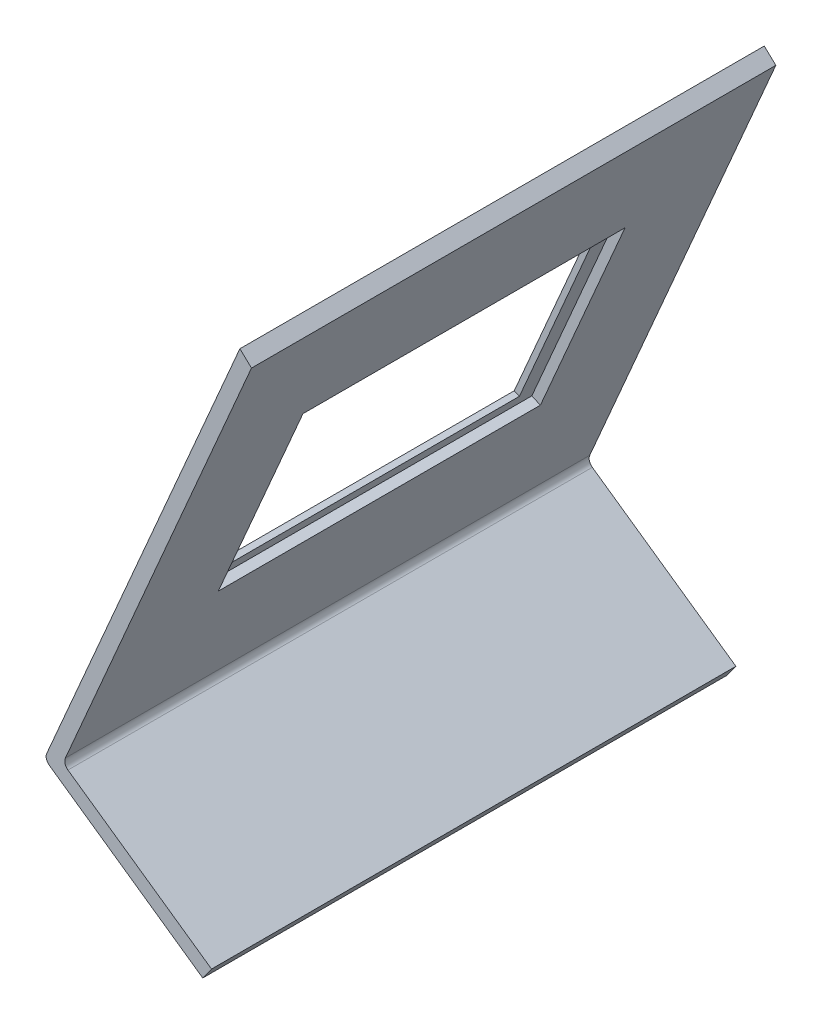
ISO-10303-21;
HEADER;
FILE_DESCRIPTION(('STEP AP214'),'2;1');
FILE_NAME('part.step','',(''),(''),'','','');
FILE_SCHEMA(('AUTOMOTIVE_DESIGN { 1 0 10303 214 1 1 1 1 }'));
ENDSEC;
DATA;
#1=APPLICATION_CONTEXT('core data for automotive mechanical design processes');
#2=APPLICATION_PROTOCOL_DEFINITION('international standard','automotive_design',2000,#1);
#3=PRODUCT_CONTEXT('',#1,'mechanical');
#4=PRODUCT('Part','Part','',(#3));
#5=PRODUCT_RELATED_PRODUCT_CATEGORY('part','',(#4));
#6=PRODUCT_DEFINITION_FORMATION('','',#4);
#7=PRODUCT_DEFINITION_CONTEXT('part definition',#1,'design');
#8=PRODUCT_DEFINITION('design','',#6,#7);
#9=PRODUCT_DEFINITION_SHAPE('','',#8);
#10=(LENGTH_UNIT() NAMED_UNIT(*) SI_UNIT(.MILLI.,.METRE.));
#11=(NAMED_UNIT(*) PLANE_ANGLE_UNIT() SI_UNIT($,.RADIAN.));
#12=(NAMED_UNIT(*) SI_UNIT($,.STERADIAN.) SOLID_ANGLE_UNIT());
#13=UNCERTAINTY_MEASURE_WITH_UNIT(LENGTH_MEASURE(1.E-05),#10,'distance_accuracy_value','');
#14=(GEOMETRIC_REPRESENTATION_CONTEXT(3) GLOBAL_UNCERTAINTY_ASSIGNED_CONTEXT((#13)) GLOBAL_UNIT_ASSIGNED_CONTEXT((#10,
#11,#12)) REPRESENTATION_CONTEXT('',''));
#15=CARTESIAN_POINT('',(0.,0.,0.));
#16=DIRECTION('',(0.,0.,1.));
#17=DIRECTION('',(1.,0.,0.));
#18=AXIS2_PLACEMENT_3D('',#15,#16,#17);
#19=CARTESIAN_POINT('',(13.5818415381511,148.863586311308,-140.));
#20=DIRECTION('',(0.917997186135404,-0.396586896212521,0.));
#21=DIRECTION('',(0.396586896212521,0.917997186135404,0.));
#22=AXIS2_PLACEMENT_3D('',#19,#20,#21);
#23=PLANE('',#22);
#24=DIRECTION('',(0.396586896212521,0.917997186135404,0.));
#25=VECTOR('',#24,1.);
#26=CARTESIAN_POINT('',(-0.247086932173506,116.853155446686,-113.));
#27=LINE('',#26,#25);
#28=CARTESIAN_POINT('',(-22.8525400162872,64.5273158369683,-113.));
#29=VERTEX_POINT('',#28);
#30=CARTESIAN_POINT('',(-0.247086932173493,116.853155446686,-113.));
#31=VERTEX_POINT('',#30);
#32=EDGE_CURVE('E61',#29,#31,#27,.T.);
#33=ORIENTED_EDGE('',*,*,#32,.F.);
#34=DIRECTION('',(0.,0.,-1.));
#35=VECTOR('',#34,1.);
#36=CARTESIAN_POINT('',(-22.8525400162872,64.5273158369683,-113.));
#37=LINE('',#36,#35);
#38=CARTESIAN_POINT('',(-22.8525400162872,64.5273158369682,-27.));
#39=VERTEX_POINT('',#38);
#40=EDGE_CURVE('E280',#39,#29,#37,.T.);
#41=ORIENTED_EDGE('',*,*,#40,.F.);
#42=DIRECTION('',(-0.396586896212521,-0.917997186135404,0.));
#43=VECTOR('',#42,1.);
#44=CARTESIAN_POINT('',(-22.8525400162872,64.5273158369682,-27.));
#45=LINE('',#44,#43);
#46=CARTESIAN_POINT('',(-0.247086932173506,116.853155446686,-27.));
#47=VERTEX_POINT('',#46);
#48=EDGE_CURVE('E287',#47,#39,#45,.T.);
#49=ORIENTED_EDGE('',*,*,#48,.F.);
#50=DIRECTION('',(0.,0.,1.));
#51=VECTOR('',#50,1.);
#52=CARTESIAN_POINT('',(-0.247086932173506,116.853155446686,-27.));
#53=LINE('',#52,#51);
#54=EDGE_CURVE('E286',#31,#47,#53,.T.);
#55=ORIENTED_EDGE('',*,*,#54,.F.);
#56=EDGE_LOOP('',(#33,#41,#49,#55));
#57=FACE_BOUND('',#56,.T.);
#58=DIRECTION('',(0.396586896212521,0.917997186135404,0.));
#59=VECTOR('',#58,1.);
#60=CARTESIAN_POINT('',(13.5818415381511,148.863586311308,-140.));
#61=LINE('',#60,#59);
#62=CARTESIAN_POINT('',(-36.6814684866118,32.5168849723467,-140.));
#63=VERTEX_POINT('',#62);
#64=CARTESIAN_POINT('',(13.0044582360656,147.527091707734,-140.));
#65=VERTEX_POINT('',#64);
#66=EDGE_CURVE('E177',#63,#65,#61,.T.);
#67=ORIENTED_EDGE('',*,*,#66,.T.);
#68=DIRECTION('',(0.,0.,1.));
#69=VECTOR('',#68,1.);
#70=CARTESIAN_POINT('',(13.0044582360656,147.527091707734,-140.));
#71=LINE('',#70,#69);
#72=CARTESIAN_POINT('',(13.0044582360656,147.527091707734,0.));
#73=VERTEX_POINT('',#72);
#74=EDGE_CURVE('E160',#65,#73,#71,.T.);
#75=ORIENTED_EDGE('',*,*,#74,.T.);
#76=DIRECTION('',(0.396586896212521,0.917997186135404,0.));
#77=VECTOR('',#76,1.);
#78=CARTESIAN_POINT('',(13.5818415381511,148.863586311308,0.));
#79=LINE('',#78,#77);
#80=CARTESIAN_POINT('',(-36.6814684866118,32.5168849723467,0.));
#81=VERTEX_POINT('',#80);
#82=EDGE_CURVE('E198',#81,#73,#79,.T.);
#83=ORIENTED_EDGE('',*,*,#82,.F.);
#84=DIRECTION('',(0.,0.,1.));
#85=VECTOR('',#84,1.);
#86=CARTESIAN_POINT('',(-36.6814684866118,32.5168849723467,-140.));
#87=LINE('',#86,#85);
#88=EDGE_CURVE('E173',#63,#81,#87,.T.);
#89=ORIENTED_EDGE('',*,*,#88,.F.);
#90=EDGE_LOOP('',(#67,#75,#83,#89));
#91=FACE_BOUND('',#90,.T.);
#92=ADVANCED_FACE('F39',(#57,#91),#23,.T.);
#93=CARTESIAN_POINT('',(-40.9576022144495,28.6788218175524,-140.));
#94=DIRECTION('',(-0.573576436351047,-0.819152044288991,0.));
#95=DIRECTION('',(0.819152044288991,-0.573576436351047,0.));
#96=AXIS2_PLACEMENT_3D('',#93,#94,#95);
#97=PLANE('',#96);
#98=DIRECTION('',(0.819152044288991,-0.573576436351047,0.));
#99=VECTOR('',#98,1.);
#100=CARTESIAN_POINT('',(-40.9576022144495,28.6788218175524,0.));
#101=LINE('',#100,#99);
#102=CARTESIAN_POINT('',(-40.9576022144495,28.6788218175524,0.));
#103=VERTEX_POINT('',#102);
#104=CARTESIAN_POINT('',(0.,0.,0.));
#105=VERTEX_POINT('',#104);
#106=EDGE_CURVE('E187',#103,#105,#101,.T.);
#107=ORIENTED_EDGE('',*,*,#106,.F.);
#108=DIRECTION('',(0.,0.,1.));
#109=VECTOR('',#108,1.);
#110=CARTESIAN_POINT('',(-40.9576022144495,28.6788218175524,-140.));
#111=LINE('',#110,#109);
#112=CARTESIAN_POINT('',(-40.9576022144495,28.6788218175524,-140.));
#113=VERTEX_POINT('',#112);
#114=EDGE_CURVE('E11',#113,#103,#111,.T.);
#115=ORIENTED_EDGE('',*,*,#114,.F.);
#116=DIRECTION('',(0.819152044288991,-0.573576436351047,0.));
#117=VECTOR('',#116,1.);
#118=CARTESIAN_POINT('',(-40.9576022144495,28.6788218175524,-140.));
#119=LINE('',#118,#117);
#120=CARTESIAN_POINT('',(0.,0.,-140.));
#121=VERTEX_POINT('',#120);
#122=EDGE_CURVE('E202',#113,#121,#119,.T.);
#123=ORIENTED_EDGE('',*,*,#122,.T.);
#124=DIRECTION('',(0.,0.,1.));
#125=VECTOR('',#124,1.);
#126=CARTESIAN_POINT('',(0.,0.,-140.));
#127=LINE('',#126,#125);
#128=EDGE_CURVE('E43',#121,#105,#127,.T.);
#129=ORIENTED_EDGE('',*,*,#128,.T.);
#130=EDGE_LOOP('',(#107,#115,#123,#129));
#131=FACE_BOUND('',#130,.T.);
#132=ADVANCED_FACE('F41',(#131),#97,.T.);
#133=CARTESIAN_POINT('',(-39.8104493417475,30.3171259061304,-140.));
#134=DIRECTION('',(0.,0.,1.));
#135=DIRECTION('',(1.,0.,0.));
#136=AXIS2_PLACEMENT_3D('',#133,#134,#135);
#137=CYLINDRICAL_SURFACE('',#136,2.);
#138=CARTESIAN_POINT('',(-39.8104493417475,30.3171259061304,0.));
#139=DIRECTION('',(0.,0.,1.));
#140=DIRECTION('',(-1.,0.,0.));
#141=AXIS2_PLACEMENT_3D('',#138,#139,#140);
#142=CIRCLE('',#141,2.);
#143=CARTESIAN_POINT('',(-41.6464437140183,31.1102996985554,0.));
#144=VERTEX_POINT('',#143);
#145=EDGE_CURVE('E205',#144,#103,#142,.T.);
#146=ORIENTED_EDGE('',*,*,#145,.F.);
#147=DIRECTION('',(0.,0.,1.));
#148=VECTOR('',#147,1.);
#149=CARTESIAN_POINT('',(-41.6464437140183,31.1102996985554,-140.));
#150=LINE('',#149,#148);
#151=CARTESIAN_POINT('',(-41.6464437140183,31.1102996985554,-140.));
#152=VERTEX_POINT('',#151);
#153=EDGE_CURVE('E48',#152,#144,#150,.T.);
#154=ORIENTED_EDGE('',*,*,#153,.F.);
#155=CARTESIAN_POINT('',(-39.8104493417475,30.3171259061304,-140.));
#156=DIRECTION('',(0.,0.,1.));
#157=DIRECTION('',(-1.,0.,0.));
#158=AXIS2_PLACEMENT_3D('',#155,#156,#157);
#159=CIRCLE('',#158,2.);
#160=EDGE_CURVE('E178',#152,#113,#159,.T.);
#161=ORIENTED_EDGE('',*,*,#160,.T.);
#162=ORIENTED_EDGE('',*,*,#114,.T.);
#163=EDGE_LOOP('',(#146,#154,#161,#162));
#164=FACE_BOUND('',#163,.T.);
#165=ADVANCED_FACE('F223',(#164),#137,.T.);
#166=CARTESIAN_POINT('',(-41.6464437140183,31.1102996985554,-140.));
#167=DIRECTION('',(-0.917997186135404,0.396586896212521,0.));
#168=DIRECTION('',(-0.396586896212521,-0.917997186135404,0.));
#169=AXIS2_PLACEMENT_3D('',#166,#167,#168);
#170=PLANE('',#169);
#171=DIRECTION('',(0.,0.,-1.));
#172=VECTOR('',#171,1.);
#173=CARTESIAN_POINT('',(-5.10883636535266,115.68551147313,-140.));
#174=LINE('',#173,#172);
#175=CARTESIAN_POINT('',(-5.10883636535266,115.68551147313,-31.5));
#176=VERTEX_POINT('',#175);
#177=CARTESIAN_POINT('',(-5.10883636535266,115.68551147313,-108.5));
#178=VERTEX_POINT('',#177);
#179=EDGE_CURVE('E262',#176,#178,#174,.T.);
#180=ORIENTED_EDGE('',*,*,#179,.F.);
#181=DIRECTION('',(0.396586896212521,0.917997186135404,0.));
#182=VECTOR('',#181,1.);
#183=CARTESIAN_POINT('',(-41.6464437140183,31.1102996985554,-31.5));
#184=LINE('',#183,#182);
#185=CARTESIAN_POINT('',(-25.3347680721912,68.8676549802246,-31.5));
#186=VERTEX_POINT('',#185);
#187=EDGE_CURVE('E255',#186,#176,#184,.T.);
#188=ORIENTED_EDGE('',*,*,#187,.F.);
#189=DIRECTION('',(0.,0.,1.));
#190=VECTOR('',#189,1.);
#191=CARTESIAN_POINT('',(-25.3347680721912,68.8676549802246,-140.));
#192=LINE('',#191,#190);
#193=CARTESIAN_POINT('',(-25.3347680721912,68.8676549802246,-108.5));
#194=VERTEX_POINT('',#193);
#195=EDGE_CURVE('E259',#194,#186,#192,.T.);
#196=ORIENTED_EDGE('',*,*,#195,.F.);
#197=DIRECTION('',(-0.396586896212521,-0.917997186135404,0.));
#198=VECTOR('',#197,1.);
#199=CARTESIAN_POINT('',(-41.6464437140183,31.1102996985554,-108.5));
#200=LINE('',#199,#198);
#201=EDGE_CURVE('E258',#178,#194,#200,.T.);
#202=ORIENTED_EDGE('',*,*,#201,.F.);
#203=EDGE_LOOP('',(#180,#188,#196,#202));
#204=FACE_BOUND('',#203,.T.);
#205=DIRECTION('',(-0.396586896212521,-0.917997186135404,0.));
#206=VECTOR('',#205,1.);
#207=CARTESIAN_POINT('',(-41.6464437140183,31.1102996985554,0.));
#208=LINE('',#207,#206);
#209=CARTESIAN_POINT('',(9.90985279360946,150.449933896158,0.));
#210=VERTEX_POINT('',#209);
#211=EDGE_CURVE('E175',#210,#144,#208,.T.);
#212=ORIENTED_EDGE('',*,*,#211,.F.);
#213=DIRECTION('',(0.,0.,1.));
#214=VECTOR('',#213,1.);
#215=CARTESIAN_POINT('',(9.90985279360946,150.449933896158,-140.));
#216=LINE('',#215,#214);
#217=CARTESIAN_POINT('',(9.90985279360946,150.449933896158,-140.));
#218=VERTEX_POINT('',#217);
#219=EDGE_CURVE('E155',#218,#210,#216,.T.);
#220=ORIENTED_EDGE('',*,*,#219,.F.);
#221=DIRECTION('',(-0.396586896212521,-0.917997186135404,0.));
#222=VECTOR('',#221,1.);
#223=CARTESIAN_POINT('',(-41.6464437140183,31.1102996985554,-140.));
#224=LINE('',#223,#222);
#225=EDGE_CURVE('E169',#218,#152,#224,.T.);
#226=ORIENTED_EDGE('',*,*,#225,.T.);
#227=ORIENTED_EDGE('',*,*,#153,.T.);
#228=EDGE_LOOP('',(#212,#220,#226,#227));
#229=FACE_BOUND('',#228,.T.);
#230=ADVANCED_FACE('F166',(#204,#229),#170,.T.);
#231=CARTESIAN_POINT('',(-34.8454741143409,31.7237111799217,-140.));
#232=DIRECTION('',(0.,0.,1.));
#233=DIRECTION('',(1.,0.,0.));
#234=AXIS2_PLACEMENT_3D('',#231,#232,#233);
#235=CYLINDRICAL_SURFACE('',#234,2.00000000000001);
#236=CARTESIAN_POINT('',(-34.8454741143409,31.7237111799217,0.));
#237=DIRECTION('',(0.,0.,-1.));
#238=DIRECTION('',(1.,0.,0.));
#239=AXIS2_PLACEMENT_3D('',#236,#237,#238);
#240=CIRCLE('',#239,2.00000000000001);
#241=CARTESIAN_POINT('',(-35.992626987043,30.0854070913437,0.));
#242=VERTEX_POINT('',#241);
#243=EDGE_CURVE('E196',#242,#81,#240,.T.);
#244=ORIENTED_EDGE('',*,*,#243,.F.);
#245=DIRECTION('',(0.,0.,1.));
#246=VECTOR('',#245,1.);
#247=CARTESIAN_POINT('',(-35.992626987043,30.0854070913437,-140.));
#248=LINE('',#247,#246);
#249=CARTESIAN_POINT('',(-35.992626987043,30.0854070913437,-140.));
#250=VERTEX_POINT('',#249);
#251=EDGE_CURVE('E209',#250,#242,#248,.T.);
#252=ORIENTED_EDGE('',*,*,#251,.F.);
#253=CARTESIAN_POINT('',(-34.8454741143409,31.7237111799217,-140.));
#254=DIRECTION('',(0.,0.,-1.));
#255=DIRECTION('',(1.,0.,0.));
#256=AXIS2_PLACEMENT_3D('',#253,#254,#255);
#257=CIRCLE('',#256,2.00000000000001);
#258=EDGE_CURVE('E185',#250,#63,#257,.T.);
#259=ORIENTED_EDGE('',*,*,#258,.T.);
#260=ORIENTED_EDGE('',*,*,#88,.T.);
#261=EDGE_LOOP('',(#244,#252,#259,#260));
#262=FACE_BOUND('',#261,.T.);
#263=ADVANCED_FACE('F237',(#262),#235,.F.);
#264=CARTESIAN_POINT('',(-35.992626987043,30.0854070913437,-140.));
#265=DIRECTION('',(0.573576436351047,0.819152044288991,0.));
#266=DIRECTION('',(-0.819152044288991,0.573576436351047,0.));
#267=AXIS2_PLACEMENT_3D('',#264,#265,#266);
#268=PLANE('',#267);
#269=DIRECTION('',(-0.819152044288991,0.573576436351047,0.));
#270=VECTOR('',#269,1.);
#271=CARTESIAN_POINT('',(-35.992626987043,30.0854070913437,0.));
#272=LINE('',#271,#270);
#273=CARTESIAN_POINT('',(2.34276801258474,3.24267453235741,0.));
#274=VERTEX_POINT('',#273);
#275=EDGE_CURVE('E194',#274,#242,#272,.T.);
#276=ORIENTED_EDGE('',*,*,#275,.F.);
#277=DIRECTION('',(0.,0.,1.));
#278=VECTOR('',#277,1.);
#279=CARTESIAN_POINT('',(2.34276801258474,3.24267453235741,-140.));
#280=LINE('',#279,#278);
#281=CARTESIAN_POINT('',(2.34276801258474,3.24267453235741,-140.));
#282=VERTEX_POINT('',#281);
#283=EDGE_CURVE('E208',#282,#274,#280,.T.);
#284=ORIENTED_EDGE('',*,*,#283,.F.);
#285=DIRECTION('',(-0.819152044288991,0.573576436351047,0.));
#286=VECTOR('',#285,1.);
#287=CARTESIAN_POINT('',(-35.992626987043,30.0854070913437,-140.));
#288=LINE('',#287,#286);
#289=EDGE_CURVE('E226',#282,#250,#288,.T.);
#290=ORIENTED_EDGE('',*,*,#289,.T.);
#291=ORIENTED_EDGE('',*,*,#251,.T.);
#292=EDGE_LOOP('',(#276,#284,#290,#291));
#293=FACE_BOUND('',#292,.T.);
#294=ADVANCED_FACE('F245',(#293),#268,.T.);
#295=CARTESIAN_POINT('',(0.,0.,-140.));
#296=DIRECTION('',(0.810579978634954,-0.585627952061851,0.));
#297=DIRECTION('',(0.585627952061851,0.810579978634954,0.));
#298=AXIS2_PLACEMENT_3D('',#295,#296,#297);
#299=PLANE('',#298);
#300=DIRECTION('',(0.585627952061851,0.810579978634954,0.));
#301=VECTOR('',#300,1.);
#302=CARTESIAN_POINT('',(0.,0.,0.));
#303=LINE('',#302,#301);
#304=EDGE_CURVE('E186',#105,#274,#303,.T.);
#305=ORIENTED_EDGE('',*,*,#304,.F.);
#306=ORIENTED_EDGE('',*,*,#128,.F.);
#307=DIRECTION('',(0.585627952061851,0.810579978634954,0.));
#308=VECTOR('',#307,1.);
#309=CARTESIAN_POINT('',(0.,0.,-140.));
#310=LINE('',#309,#308);
#311=EDGE_CURVE('E228',#121,#282,#310,.T.);
#312=ORIENTED_EDGE('',*,*,#311,.T.);
#313=ORIENTED_EDGE('',*,*,#283,.T.);
#314=EDGE_LOOP('',(#305,#306,#312,#313));
#315=FACE_BOUND('',#314,.T.);
#316=ADVANCED_FACE('F218',(#315),#299,.T.);
#317=CARTESIAN_POINT('',(-34.8454741143409,31.7237111799217,-140.));
#318=DIRECTION('',(0.,0.,1.));
#319=DIRECTION('',(1.,0.,0.));
#320=AXIS2_PLACEMENT_3D('',#317,#318,#319);
#321=PLANE('',#320);
#322=ORIENTED_EDGE('',*,*,#225,.F.);
#323=DIRECTION('',(0.726994474629982,-0.686643309045881,0.));
#324=VECTOR('',#323,1.);
#325=CARTESIAN_POINT('',(9.90985279360946,150.449933896158,-140.));
#326=LINE('',#325,#324);
#327=EDGE_CURVE('E152',#218,#65,#326,.T.);
#328=ORIENTED_EDGE('',*,*,#327,.T.);
#329=ORIENTED_EDGE('',*,*,#66,.F.);
#330=ORIENTED_EDGE('',*,*,#258,.F.);
#331=ORIENTED_EDGE('',*,*,#289,.F.);
#332=ORIENTED_EDGE('',*,*,#311,.F.);
#333=ORIENTED_EDGE('',*,*,#122,.F.);
#334=ORIENTED_EDGE('',*,*,#160,.F.);
#335=EDGE_LOOP('',(#322,#328,#329,#330,#331,#332,#333,#334));
#336=FACE_BOUND('',#335,.T.);
#337=ADVANCED_FACE('F174',(#336),#321,.F.);
#338=CARTESIAN_POINT('',(-34.8454741143409,31.7237111799217,0.));
#339=DIRECTION('',(0.,0.,1.));
#340=DIRECTION('',(1.,0.,0.));
#341=AXIS2_PLACEMENT_3D('',#338,#339,#340);
#342=PLANE('',#341);
#343=DIRECTION('',(0.726994474629982,-0.686643309045881,0.));
#344=VECTOR('',#343,1.);
#345=CARTESIAN_POINT('',(9.90985279360946,150.449933896158,0.));
#346=LINE('',#345,#344);
#347=EDGE_CURVE('E161',#210,#73,#346,.T.);
#348=ORIENTED_EDGE('',*,*,#347,.F.);
#349=ORIENTED_EDGE('',*,*,#211,.T.);
#350=ORIENTED_EDGE('',*,*,#145,.T.);
#351=ORIENTED_EDGE('',*,*,#106,.T.);
#352=ORIENTED_EDGE('',*,*,#304,.T.);
#353=ORIENTED_EDGE('',*,*,#275,.T.);
#354=ORIENTED_EDGE('',*,*,#243,.T.);
#355=ORIENTED_EDGE('',*,*,#82,.T.);
#356=EDGE_LOOP('',(#348,#349,#350,#351,#352,#353,#354,#355));
#357=FACE_BOUND('',#356,.T.);
#358=ADVANCED_FACE('F224',(#357),#342,.T.);
#359=CARTESIAN_POINT('',(-2.54207989751202,117.844622687218,-113.));
#360=DIRECTION('',(0.,0.,-1.));
#361=DIRECTION('',(0.,1.,0.));
#362=AXIS2_PLACEMENT_3D('',#359,#360,#361);
#363=PLANE('',#362);
#364=ORIENTED_EDGE('',*,*,#32,.T.);
#365=DIRECTION('',(0.917997186135404,-0.396586896212521,0.));
#366=VECTOR('',#365,1.);
#367=CARTESIAN_POINT('',(-2.54207989751202,117.844622687218,-113.));
#368=LINE('',#367,#366);
#369=CARTESIAN_POINT('',(-2.54207989751202,117.844622687218,-113.));
#370=VERTEX_POINT('',#369);
#371=EDGE_CURVE('E233',#370,#31,#368,.T.);
#372=ORIENTED_EDGE('',*,*,#371,.F.);
#373=DIRECTION('',(0.396586896212521,0.917997186135404,0.));
#374=VECTOR('',#373,1.);
#375=CARTESIAN_POINT('',(-2.54207989751202,117.844622687218,-113.));
#376=LINE('',#375,#374);
#377=CARTESIAN_POINT('',(-25.1475329816257,65.5187830774996,-113.));
#378=VERTEX_POINT('',#377);
#379=EDGE_CURVE('E271',#378,#370,#376,.T.);
#380=ORIENTED_EDGE('',*,*,#379,.F.);
#381=DIRECTION('',(0.917997186135404,-0.396586896212521,0.));
#382=VECTOR('',#381,1.);
#383=CARTESIAN_POINT('',(-25.1475329816257,65.5187830774996,-113.));
#384=LINE('',#383,#382);
#385=EDGE_CURVE('E188',#378,#29,#384,.T.);
#386=ORIENTED_EDGE('',*,*,#385,.T.);
#387=EDGE_LOOP('',(#364,#372,#380,#386));
#388=FACE_BOUND('',#387,.T.);
#389=ADVANCED_FACE('F313',(#388),#363,.F.);
#390=CARTESIAN_POINT('',(-25.1475329816257,65.5187830774996,-113.));
#391=DIRECTION('',(-0.396586896212521,-0.917997186135404,0.));
#392=DIRECTION('',(0.917997186135404,-0.396586896212521,0.));
#393=AXIS2_PLACEMENT_3D('',#390,#391,#392);
#394=PLANE('',#393);
#395=ORIENTED_EDGE('',*,*,#40,.T.);
#396=ORIENTED_EDGE('',*,*,#385,.F.);
#397=DIRECTION('',(0.,0.,-1.));
#398=VECTOR('',#397,1.);
#399=CARTESIAN_POINT('',(-25.1475329816257,65.5187830774996,-113.));
#400=LINE('',#399,#398);
#401=CARTESIAN_POINT('',(-25.1475329816257,65.5187830774995,-27.));
#402=VERTEX_POINT('',#401);
#403=EDGE_CURVE('E284',#402,#378,#400,.T.);
#404=ORIENTED_EDGE('',*,*,#403,.F.);
#405=DIRECTION('',(0.917997186135404,-0.396586896212521,0.));
#406=VECTOR('',#405,1.);
#407=CARTESIAN_POINT('',(-25.1475329816257,65.5187830774995,-27.));
#408=LINE('',#407,#406);
#409=EDGE_CURVE('E298',#402,#39,#408,.T.);
#410=ORIENTED_EDGE('',*,*,#409,.T.);
#411=EDGE_LOOP('',(#395,#396,#404,#410));
#412=FACE_BOUND('',#411,.T.);
#413=ADVANCED_FACE('F312',(#412),#394,.F.);
#414=CARTESIAN_POINT('',(-25.1475329816257,65.5187830774995,-27.));
#415=DIRECTION('',(0.,0.,1.));
#416=DIRECTION('',(1.,0.,0.));
#417=AXIS2_PLACEMENT_3D('',#414,#415,#416);
#418=PLANE('',#417);
#419=ORIENTED_EDGE('',*,*,#48,.T.);
#420=ORIENTED_EDGE('',*,*,#409,.F.);
#421=DIRECTION('',(-0.396586896212521,-0.917997186135404,0.));
#422=VECTOR('',#421,1.);
#423=CARTESIAN_POINT('',(-25.1475329816257,65.5187830774995,-27.));
#424=LINE('',#423,#422);
#425=CARTESIAN_POINT('',(-2.54207989751202,117.844622687218,-27.));
#426=VERTEX_POINT('',#425);
#427=EDGE_CURVE('E278',#426,#402,#424,.T.);
#428=ORIENTED_EDGE('',*,*,#427,.F.);
#429=DIRECTION('',(0.917997186135404,-0.396586896212521,0.));
#430=VECTOR('',#429,1.);
#431=CARTESIAN_POINT('',(-2.54207989751202,117.844622687218,-27.));
#432=LINE('',#431,#430);
#433=EDGE_CURVE('E300',#426,#47,#432,.T.);
#434=ORIENTED_EDGE('',*,*,#433,.T.);
#435=EDGE_LOOP('',(#419,#420,#428,#434));
#436=FACE_BOUND('',#435,.T.);
#437=ADVANCED_FACE('F308',(#436),#418,.F.);
#438=CARTESIAN_POINT('',(-2.54207989751202,117.844622687218,-27.));
#439=DIRECTION('',(0.396586896212521,0.917997186135404,0.));
#440=DIRECTION('',(-0.917997186135404,0.396586896212521,0.));
#441=AXIS2_PLACEMENT_3D('',#438,#439,#440);
#442=PLANE('',#441);
#443=ORIENTED_EDGE('',*,*,#54,.T.);
#444=ORIENTED_EDGE('',*,*,#433,.F.);
#445=DIRECTION('',(0.,0.,1.));
#446=VECTOR('',#445,1.);
#447=CARTESIAN_POINT('',(-2.54207989751202,117.844622687218,-27.));
#448=LINE('',#447,#446);
#449=EDGE_CURVE('E277',#370,#426,#448,.T.);
#450=ORIENTED_EDGE('',*,*,#449,.F.);
#451=ORIENTED_EDGE('',*,*,#371,.T.);
#452=EDGE_LOOP('',(#443,#444,#450,#451));
#453=FACE_BOUND('',#452,.T.);
#454=ADVANCED_FACE('F303',(#453),#442,.F.);
#455=CARTESIAN_POINT('',(-45.0454383276103,19.4602236746339,0.));
#456=DIRECTION('',(-0.917997186135404,0.396586896212521,0.));
#457=DIRECTION('',(-0.396586896212521,-0.917997186135404,0.));
#458=AXIS2_PLACEMENT_3D('',#455,#456,#457);
#459=PLANE('',#458);
#460=DIRECTION('',(-0.396586896212521,-0.917997186135404,0.));
#461=VECTOR('',#460,1.);
#462=CARTESIAN_POINT('',(-23.9577722929881,68.2727746359058,-31.5));
#463=LINE('',#462,#461);
#464=CARTESIAN_POINT('',(-3.73184058614958,115.090631128811,-31.5));
#465=VERTEX_POINT('',#464);
#466=CARTESIAN_POINT('',(-23.9577722929882,68.2727746359058,-31.5));
#467=VERTEX_POINT('',#466);
#468=EDGE_CURVE('E263',#465,#467,#463,.T.);
#469=ORIENTED_EDGE('',*,*,#468,.F.);
#470=DIRECTION('',(0.,0.,1.));
#471=VECTOR('',#470,1.);
#472=CARTESIAN_POINT('',(-3.73184058614958,115.090631128811,-31.5));
#473=LINE('',#472,#471);
#474=CARTESIAN_POINT('',(-3.73184058614957,115.090631128811,-108.5));
#475=VERTEX_POINT('',#474);
#476=EDGE_CURVE('E267',#475,#465,#473,.T.);
#477=ORIENTED_EDGE('',*,*,#476,.F.);
#478=DIRECTION('',(0.396586896212521,0.917997186135404,0.));
#479=VECTOR('',#478,1.);
#480=CARTESIAN_POINT('',(-3.73184058614957,115.090631128811,-108.5));
#481=LINE('',#480,#479);
#482=CARTESIAN_POINT('',(-23.9577722929881,68.2727746359058,-108.5));
#483=VERTEX_POINT('',#482);
#484=EDGE_CURVE('E270',#483,#475,#481,.T.);
#485=ORIENTED_EDGE('',*,*,#484,.F.);
#486=DIRECTION('',(0.,0.,-1.));
#487=VECTOR('',#486,1.);
#488=CARTESIAN_POINT('',(-23.9577722929881,68.2727746359058,-108.5));
#489=LINE('',#488,#487);
#490=EDGE_CURVE('E269',#467,#483,#489,.T.);
#491=ORIENTED_EDGE('',*,*,#490,.F.);
#492=EDGE_LOOP('',(#469,#477,#485,#491));
#493=FACE_BOUND('',#492,.T.);
#494=ORIENTED_EDGE('',*,*,#379,.T.);
#495=ORIENTED_EDGE('',*,*,#449,.T.);
#496=ORIENTED_EDGE('',*,*,#427,.T.);
#497=ORIENTED_EDGE('',*,*,#403,.T.);
#498=EDGE_LOOP('',(#494,#495,#496,#497));
#499=FACE_BOUND('',#498,.T.);
#500=ADVANCED_FACE('F315',(#493,#499),#459,.F.);
#501=CARTESIAN_POINT('',(-48.6945090621886,134.515097135524,-108.5));
#502=DIRECTION('',(0.396586896212521,0.917997186135404,0.));
#503=DIRECTION('',(-0.917997186135404,0.396586896212521,0.));
#504=AXIS2_PLACEMENT_3D('',#501,#502,#503);
#505=PLANE('',#504);
#506=ORIENTED_EDGE('',*,*,#179,.T.);
#507=DIRECTION('',(0.917997186135404,-0.396586896212521,0.));
#508=VECTOR('',#507,1.);
#509=CARTESIAN_POINT('',(-48.6945090621886,134.515097135524,-108.5));
#510=LINE('',#509,#508);
#511=EDGE_CURVE('E248',#178,#475,#510,.T.);
#512=ORIENTED_EDGE('',*,*,#511,.T.);
#513=ORIENTED_EDGE('',*,*,#476,.T.);
#514=DIRECTION('',(0.917997186135404,-0.396586896212521,0.));
#515=VECTOR('',#514,1.);
#516=CARTESIAN_POINT('',(-48.6945090621886,134.515097135524,-31.5));
#517=LINE('',#516,#515);
#518=EDGE_CURVE('E242',#176,#465,#517,.T.);
#519=ORIENTED_EDGE('',*,*,#518,.F.);
#520=EDGE_LOOP('',(#506,#512,#513,#519));
#521=FACE_BOUND('',#520,.T.);
#522=ADVANCED_FACE('F357',(#521),#505,.F.);
#523=CARTESIAN_POINT('',(-68.9204407690272,87.6972406426183,-108.5));
#524=DIRECTION('',(0.,0.,-1.));
#525=DIRECTION('',(0.,1.,0.));
#526=AXIS2_PLACEMENT_3D('',#523,#524,#525);
#527=PLANE('',#526);
#528=ORIENTED_EDGE('',*,*,#201,.T.);
#529=DIRECTION('',(0.917997186135404,-0.396586896212521,0.));
#530=VECTOR('',#529,1.);
#531=CARTESIAN_POINT('',(-68.9204407690272,87.6972406426183,-108.5));
#532=LINE('',#531,#530);
#533=EDGE_CURVE('E254',#194,#483,#532,.T.);
#534=ORIENTED_EDGE('',*,*,#533,.T.);
#535=ORIENTED_EDGE('',*,*,#484,.T.);
#536=ORIENTED_EDGE('',*,*,#511,.F.);
#537=EDGE_LOOP('',(#528,#534,#535,#536));
#538=FACE_BOUND('',#537,.T.);
#539=ADVANCED_FACE('F359',(#538),#527,.F.);
#540=CARTESIAN_POINT('',(-68.9204407690272,87.6972406426183,-31.5));
#541=DIRECTION('',(-0.396586896212521,-0.917997186135404,0.));
#542=DIRECTION('',(0.917997186135404,-0.396586896212521,0.));
#543=AXIS2_PLACEMENT_3D('',#540,#541,#542);
#544=PLANE('',#543);
#545=ORIENTED_EDGE('',*,*,#195,.T.);
#546=DIRECTION('',(0.917997186135404,-0.396586896212521,0.));
#547=VECTOR('',#546,1.);
#548=CARTESIAN_POINT('',(-68.9204407690272,87.6972406426183,-31.5));
#549=LINE('',#548,#547);
#550=EDGE_CURVE('E57',#186,#467,#549,.T.);
#551=ORIENTED_EDGE('',*,*,#550,.T.);
#552=ORIENTED_EDGE('',*,*,#490,.T.);
#553=ORIENTED_EDGE('',*,*,#533,.F.);
#554=EDGE_LOOP('',(#545,#551,#552,#553));
#555=FACE_BOUND('',#554,.T.);
#556=ADVANCED_FACE('F368',(#555),#544,.F.);
#557=CARTESIAN_POINT('',(-48.6945090621886,134.515097135524,-31.5));
#558=DIRECTION('',(0.,0.,1.));
#559=DIRECTION('',(1.,0.,0.));
#560=AXIS2_PLACEMENT_3D('',#557,#558,#559);
#561=PLANE('',#560);
#562=ORIENTED_EDGE('',*,*,#187,.T.);
#563=ORIENTED_EDGE('',*,*,#518,.T.);
#564=ORIENTED_EDGE('',*,*,#468,.T.);
#565=ORIENTED_EDGE('',*,*,#550,.F.);
#566=EDGE_LOOP('',(#562,#563,#564,#565));
#567=FACE_BOUND('',#566,.T.);
#568=ADVANCED_FACE('F366',(#567),#561,.F.);
#569=CARTESIAN_POINT('',(9.90985279360946,150.449933896158,-140.));
#570=DIRECTION('',(-0.686643309045881,-0.726994474629981,0.));
#571=DIRECTION('',(0.726994474629981,-0.686643309045881,0.));
#572=AXIS2_PLACEMENT_3D('',#569,#570,#571);
#573=PLANE('',#572);
#574=ORIENTED_EDGE('',*,*,#347,.T.);
#575=ORIENTED_EDGE('',*,*,#74,.F.);
#576=ORIENTED_EDGE('',*,*,#327,.F.);
#577=ORIENTED_EDGE('',*,*,#219,.T.);
#578=EDGE_LOOP('',(#574,#575,#576,#577));
#579=FACE_BOUND('',#578,.T.);
#580=ADVANCED_FACE('F153',(#579),#573,.F.);
#581=CLOSED_SHELL('',(#92,#132,#165,#230,#263,#294,#316,#337,#358,#389,#413,#437,#454,#500,#522,
#539,#556,#568,#580));
#582=MANIFOLD_SOLID_BREP('B2',#581);
#583=ADVANCED_BREP_SHAPE_REPRESENTATION('',(#18,#582),#14);
#584=SHAPE_DEFINITION_REPRESENTATION(#9,#583);
ENDSEC;
END-ISO-10303-21;
